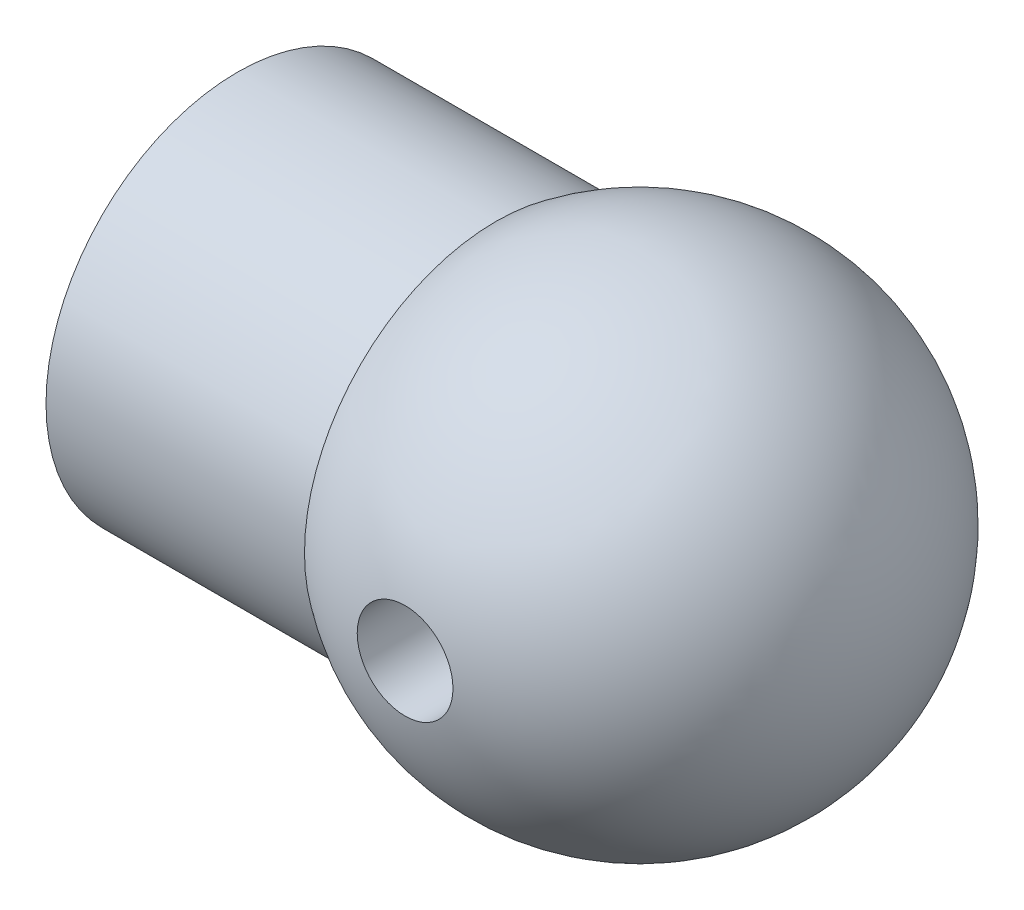
ISO-10303-21;
HEADER;
FILE_DESCRIPTION(('STEP AP214'),'2;1');
FILE_NAME('part.step','',(''),(''),'','','');
FILE_SCHEMA(('AUTOMOTIVE_DESIGN { 1 0 10303 214 1 1 1 1 }'));
ENDSEC;
DATA;
#1=APPLICATION_CONTEXT('core data for automotive mechanical design processes');
#2=APPLICATION_PROTOCOL_DEFINITION('international standard','automotive_design',2000,#1);
#3=PRODUCT_CONTEXT('',#1,'mechanical');
#4=PRODUCT('Part','Part','',(#3));
#5=PRODUCT_RELATED_PRODUCT_CATEGORY('part','',(#4));
#6=PRODUCT_DEFINITION_FORMATION('','',#4);
#7=PRODUCT_DEFINITION_CONTEXT('part definition',#1,'design');
#8=PRODUCT_DEFINITION('design','',#6,#7);
#9=PRODUCT_DEFINITION_SHAPE('','',#8);
#10=(LENGTH_UNIT() NAMED_UNIT(*) SI_UNIT(.MILLI.,.METRE.));
#11=(NAMED_UNIT(*) PLANE_ANGLE_UNIT() SI_UNIT($,.RADIAN.));
#12=(NAMED_UNIT(*) SI_UNIT($,.STERADIAN.) SOLID_ANGLE_UNIT());
#13=UNCERTAINTY_MEASURE_WITH_UNIT(LENGTH_MEASURE(1.E-05),#10,'distance_accuracy_value','');
#14=(GEOMETRIC_REPRESENTATION_CONTEXT(3) GLOBAL_UNCERTAINTY_ASSIGNED_CONTEXT((#13)) GLOBAL_UNIT_ASSIGNED_CONTEXT((#10,
#11,#12)) REPRESENTATION_CONTEXT('',''));
#15=CARTESIAN_POINT('',(0.,0.,0.));
#16=DIRECTION('',(0.,0.,1.));
#17=DIRECTION('',(1.,0.,0.));
#18=AXIS2_PLACEMENT_3D('',#15,#16,#17);
#19=CARTESIAN_POINT('',(42.,0.,0.));
#20=DIRECTION('',(-1.,0.,0.));
#21=DIRECTION('',(0.,1.,0.));
#22=AXIS2_PLACEMENT_3D('',#19,#20,#21);
#23=SPHERICAL_SURFACE('',#22,25.);
#24=CARTESIAN_POINT('',(42.,0.,24.4948974278318));
#25=DIRECTION('',(0.,0.,-1.));
#26=DIRECTION('',(-1.,0.,0.));
#27=AXIS2_PLACEMENT_3D('',#24,#25,#26);
#28=CIRCLE('',#27,5.);
#29=CARTESIAN_POINT('',(37.,0.,24.4948974278318));
#30=VERTEX_POINT('',#29);
#31=EDGE_CURVE('E38',#30,#30,#28,.T.);
#32=ORIENTED_EDGE('',*,*,#31,.T.);
#33=EDGE_LOOP('',(#32));
#34=FACE_BOUND('',#33,.T.);
#35=CARTESIAN_POINT('',(42.,0.,-24.4948974278318));
#36=DIRECTION('',(0.,0.,1.));
#37=DIRECTION('',(1.,0.,0.));
#38=AXIS2_PLACEMENT_3D('',#35,#36,#37);
#39=CIRCLE('',#38,5.);
#40=CARTESIAN_POINT('',(47.,0.,-24.4948974278318));
#41=VERTEX_POINT('',#40);
#42=EDGE_CURVE('E48',#41,#41,#39,.T.);
#43=ORIENTED_EDGE('',*,*,#42,.T.);
#44=EDGE_LOOP('',(#43));
#45=FACE_BOUND('',#44,.T.);
#46=CARTESIAN_POINT('',(27.,0.,0.));
#47=DIRECTION('',(-1.,0.,0.));
#48=DIRECTION('',(0.,0.,1.));
#49=AXIS2_PLACEMENT_3D('',#46,#47,#48);
#50=CIRCLE('',#49,20.);
#51=CARTESIAN_POINT('',(27.,0.,20.));
#52=VERTEX_POINT('',#51);
#53=EDGE_CURVE('E10',#52,#52,#50,.T.);
#54=ORIENTED_EDGE('',*,*,#53,.F.);
#55=EDGE_LOOP('',(#54));
#56=FACE_BOUND('',#55,.T.);
#57=ADVANCED_FACE('F35',(#34,#45,#56),#23,.T.);
#58=CARTESIAN_POINT('',(0.,0.,0.));
#59=DIRECTION('',(-1.,0.,0.));
#60=DIRECTION('',(0.,0.,1.));
#61=AXIS2_PLACEMENT_3D('',#58,#59,#60);
#62=CYLINDRICAL_SURFACE('',#61,20.);
#63=CARTESIAN_POINT('',(0.,0.,0.));
#64=DIRECTION('',(-1.,0.,0.));
#65=DIRECTION('',(0.,0.,1.));
#66=AXIS2_PLACEMENT_3D('',#63,#64,#65);
#67=CIRCLE('',#66,20.);
#68=CARTESIAN_POINT('',(0.,0.,20.));
#69=VERTEX_POINT('',#68);
#70=EDGE_CURVE('E42',#69,#69,#67,.T.);
#71=ORIENTED_EDGE('',*,*,#70,.F.);
#72=EDGE_LOOP('',(#71));
#73=FACE_BOUND('',#72,.T.);
#74=ORIENTED_EDGE('',*,*,#53,.T.);
#75=EDGE_LOOP('',(#74));
#76=FACE_BOUND('',#75,.T.);
#77=ADVANCED_FACE('F64',(#73,#76),#62,.T.);
#78=CARTESIAN_POINT('',(0.,0.,0.));
#79=DIRECTION('',(1.,0.,0.));
#80=DIRECTION('',(0.,0.,-1.));
#81=AXIS2_PLACEMENT_3D('',#78,#79,#80);
#82=PLANE('',#81);
#83=ORIENTED_EDGE('',*,*,#70,.T.);
#84=EDGE_LOOP('',(#83));
#85=FACE_BOUND('',#84,.T.);
#86=ADVANCED_FACE('F58',(#85),#82,.F.);
#87=CARTESIAN_POINT('',(42.,0.,-25.));
#88=DIRECTION('',(0.,0.,1.));
#89=DIRECTION('',(1.,0.,0.));
#90=AXIS2_PLACEMENT_3D('',#87,#88,#89);
#91=CYLINDRICAL_SURFACE('',#90,5.);
#92=ORIENTED_EDGE('',*,*,#42,.F.);
#93=EDGE_LOOP('',(#92));
#94=FACE_BOUND('',#93,.T.);
#95=ORIENTED_EDGE('',*,*,#31,.F.);
#96=EDGE_LOOP('',(#95));
#97=FACE_BOUND('',#96,.T.);
#98=ADVANCED_FACE('F56',(#94,#97),#91,.F.);
#99=CLOSED_SHELL('',(#57,#77,#86,#98));
#100=MANIFOLD_SOLID_BREP('B2',#99);
#101=ADVANCED_BREP_SHAPE_REPRESENTATION('',(#18,#100),#14);
#102=SHAPE_DEFINITION_REPRESENTATION(#9,#101);
ENDSEC;
END-ISO-10303-21;
